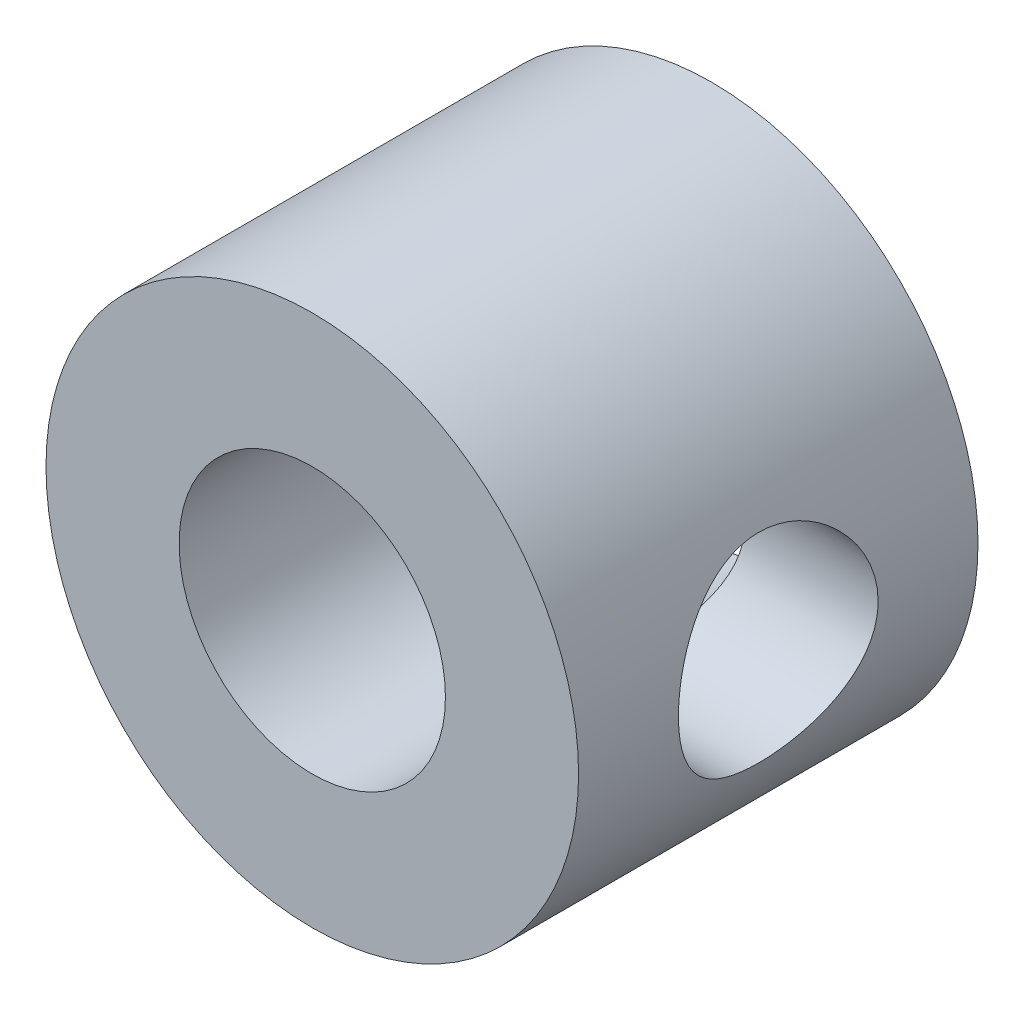
ISO-10303-21;
HEADER;
FILE_DESCRIPTION(('STEP AP214'),'2;1');
FILE_NAME('part.step','',(''),(''),'','','');
FILE_SCHEMA(('AUTOMOTIVE_DESIGN { 1 0 10303 214 1 1 1 1 }'));
ENDSEC;
DATA;
#1=APPLICATION_CONTEXT('core data for automotive mechanical design processes');
#2=APPLICATION_PROTOCOL_DEFINITION('international standard','automotive_design',2000,#1);
#3=PRODUCT_CONTEXT('',#1,'mechanical');
#4=PRODUCT('Part','Part','',(#3));
#5=PRODUCT_RELATED_PRODUCT_CATEGORY('part','',(#4));
#6=PRODUCT_DEFINITION_FORMATION('','',#4);
#7=PRODUCT_DEFINITION_CONTEXT('part definition',#1,'design');
#8=PRODUCT_DEFINITION('design','',#6,#7);
#9=PRODUCT_DEFINITION_SHAPE('','',#8);
#10=(LENGTH_UNIT() NAMED_UNIT(*) SI_UNIT(.MILLI.,.METRE.));
#11=(NAMED_UNIT(*) PLANE_ANGLE_UNIT() SI_UNIT($,.RADIAN.));
#12=(NAMED_UNIT(*) SI_UNIT($,.STERADIAN.) SOLID_ANGLE_UNIT());
#13=UNCERTAINTY_MEASURE_WITH_UNIT(LENGTH_MEASURE(1.E-05),#10,'distance_accuracy_value','');
#14=(GEOMETRIC_REPRESENTATION_CONTEXT(3) GLOBAL_UNCERTAINTY_ASSIGNED_CONTEXT((#13)) GLOBAL_UNIT_ASSIGNED_CONTEXT((#10,
#11,#12)) REPRESENTATION_CONTEXT('',''));
#15=CARTESIAN_POINT('',(0.,0.,0.));
#16=DIRECTION('',(0.,0.,1.));
#17=DIRECTION('',(1.,0.,0.));
#18=AXIS2_PLACEMENT_3D('',#15,#16,#17);
#19=CARTESIAN_POINT('',(0.,0.,6.));
#20=DIRECTION('',(0.,0.,-1.));
#21=DIRECTION('',(-1.,0.,0.));
#22=AXIS2_PLACEMENT_3D('',#19,#20,#21);
#23=CYLINDRICAL_SURFACE('',#22,4.);
#24=CARTESIAN_POINT('',(0.,0.,6.));
#25=DIRECTION('',(0.,0.,1.));
#26=DIRECTION('',(1.,0.,0.));
#27=AXIS2_PLACEMENT_3D('',#24,#25,#26);
#28=CIRCLE('',#27,4.);
#29=CARTESIAN_POINT('',(4.,0.,6.));
#30=VERTEX_POINT('',#29);
#31=EDGE_CURVE('E11',#30,#30,#28,.T.);
#32=ORIENTED_EDGE('',*,*,#31,.F.);
#33=EDGE_LOOP('',(#32));
#34=FACE_BOUND('',#33,.T.);
#35=CARTESIAN_POINT('',(0.,0.,0.));
#36=DIRECTION('',(0.,0.,1.));
#37=DIRECTION('',(1.,0.,0.));
#38=AXIS2_PLACEMENT_3D('',#35,#36,#37);
#39=CIRCLE('',#38,4.);
#40=CARTESIAN_POINT('',(4.,0.,0.));
#41=VERTEX_POINT('',#40);
#42=EDGE_CURVE('E52',#41,#41,#39,.T.);
#43=ORIENTED_EDGE('',*,*,#42,.T.);
#44=EDGE_LOOP('',(#43));
#45=FACE_BOUND('',#44,.T.);
#46=CARTESIAN_POINT('',(4.,0.,4.5));
#47=CARTESIAN_POINT('',(4.00000217456151,-0.0812350589378529,4.50000290230311));
#48=CARTESIAN_POINT('',(3.99750379283184,-0.162450241781792,4.49338023975162));
#49=CARTESIAN_POINT('',(3.98778696006928,-0.322453452352361,4.46717180473007));
#50=CARTESIAN_POINT('',(3.98056918893993,-0.401241827987616,4.44758789952943));
#51=CARTESIAN_POINT('',(3.96218832391545,-0.554060784990879,4.39624699822824));
#52=CARTESIAN_POINT('',(3.9510328434944,-0.628100224162278,4.36451348317821));
#53=CARTESIAN_POINT('',(3.92588767765353,-0.769799310160254,4.28989358698418));
#54=CARTESIAN_POINT('',(3.91189723227548,-0.837457239177879,4.24700421445584));
#55=CARTESIAN_POINT('',(3.88186246971217,-0.967346417045826,4.14938746892909));
#56=CARTESIAN_POINT('',(3.86576002583566,-1.02927073015119,4.0942697377406));
#57=CARTESIAN_POINT('',(3.83360220871327,-1.14324421474363,3.97458956534116));
#58=CARTESIAN_POINT('',(3.81754685135033,-1.19529036359203,3.91002424391213));
#59=CARTESIAN_POINT('',(3.78662470617731,-1.28998202215985,3.77028253247679));
#60=CARTESIAN_POINT('',(3.77182648820818,-1.3321939319576,3.69479563345418));
#61=CARTESIAN_POINT('',(3.74599860237433,-1.40318646334084,3.53715164583148));
#62=CARTESIAN_POINT('',(3.73496742975881,-1.43197244961239,3.4549972368449));
#63=CARTESIAN_POINT('',(3.71854412824136,-1.47408431017549,3.2898832597418));
#64=CARTESIAN_POINT('',(3.71293924350838,-1.48799593218558,3.20709496156456));
#65=CARTESIAN_POINT('',(3.70738061461215,-1.50179556531648,3.04018384200616));
#66=CARTESIAN_POINT('',(3.70742453659305,-1.5016893680263,2.95606158612553));
#67=CARTESIAN_POINT('',(3.71297511632055,-1.48790429610018,2.79423047478704));
#68=CARTESIAN_POINT('',(3.71815468871122,-1.47503808509003,2.71643909395582));
#69=CARTESIAN_POINT('',(3.73284938059529,-1.4374416786833,2.56421284959468));
#70=CARTESIAN_POINT('',(3.74236515298863,-1.41270969663258,2.48977849338612));
#71=CARTESIAN_POINT('',(3.76485702190253,-1.35163748571904,2.34472293227177));
#72=CARTESIAN_POINT('',(3.77789517988166,-1.31508648737101,2.2742005138787));
#73=CARTESIAN_POINT('',(3.80594210139319,-1.23156073762698,2.14005426240903));
#74=CARTESIAN_POINT('',(3.82095154457158,-1.18458238728897,2.0764328224803));
#75=CARTESIAN_POINT('',(3.85248038859113,-1.07781780766549,1.95339633634912));
#76=CARTESIAN_POINT('',(3.86903347455671,-1.01738298716955,1.89455135925191));
#77=CARTESIAN_POINT('',(3.90091728164085,-0.88731259081902,1.7876620337942));
#78=CARTESIAN_POINT('',(3.91624781465952,-0.817675603497364,1.73961934539433));
#79=CARTESIAN_POINT('',(3.9442639480908,-0.669723436992419,1.65506960293748));
#80=CARTESIAN_POINT('',(3.95690498259616,-0.591290713844719,1.61875241877894));
#81=CARTESIAN_POINT('',(3.97778718326962,-0.428836850524583,1.56001739572996));
#82=CARTESIAN_POINT('',(3.98603030341493,-0.344818210845767,1.53759338343888));
#83=CARTESIAN_POINT('',(3.99684443228065,-0.178375243148665,1.50837721245806));
#84=CARTESIAN_POINT('',(3.99969369025686,-0.0961036195622092,1.50081739361749));
#85=CARTESIAN_POINT('',(4.00025893700126,0.0685724752550243,1.49930893610008));
#86=CARTESIAN_POINT('',(3.99797606386863,0.150976912983373,1.50535727968322));
#87=CARTESIAN_POINT('',(3.98871709772643,0.310262048561859,1.53031004230867));
#88=CARTESIAN_POINT('',(3.98192470962305,0.387233328007336,1.54871154373709));
#89=CARTESIAN_POINT('',(3.96451477091717,0.536941754957221,1.59718607254732));
#90=CARTESIAN_POINT('',(3.9538967228203,0.609678350347535,1.62726061794804));
#91=CARTESIAN_POINT('',(3.92949624407681,0.751247765110155,1.69918641243948));
#92=CARTESIAN_POINT('',(3.91563000209348,0.819903083557795,1.74135772922339));
#93=CARTESIAN_POINT('',(3.88626671564664,0.949392711726625,1.83591810317156));
#94=CARTESIAN_POINT('',(3.87076907009516,1.01022412027045,1.88831093254515));
#95=CARTESIAN_POINT('',(3.8387332949099,1.12603079874454,2.00540412212427));
#96=CARTESIAN_POINT('',(3.82218696503729,1.18046154123569,2.0706421827727));
#97=CARTESIAN_POINT('',(3.79078815746854,1.27771050031903,2.20965138470766));
#98=CARTESIAN_POINT('',(3.77593583194399,1.32052767414518,2.2834232913885));
#99=CARTESIAN_POINT('',(3.74966829822463,1.39337773518998,2.43801598677231));
#100=CARTESIAN_POINT('',(3.73826760328493,1.42335685446918,2.51886474591044));
#101=CARTESIAN_POINT('',(3.72054032891005,1.46907883466889,2.68500976368782));
#102=CARTESIAN_POINT('',(3.71421061057491,1.48483050305535,2.77030323619812));
#103=CARTESIAN_POINT('',(3.70775894792573,1.50086347097839,2.93701615954111));
#104=CARTESIAN_POINT('',(3.70726444523341,1.50207331495837,3.01833263171689));
#105=CARTESIAN_POINT('',(3.71158412745292,1.49136715641593,3.17994531627617));
#106=CARTESIAN_POINT('',(3.71639780898899,1.47945239850124,3.26024162467158));
#107=CARTESIAN_POINT('',(3.73048141585432,1.44355815630242,3.41504722671655));
#108=CARTESIAN_POINT('',(3.73961085376663,1.41995798316524,3.48965834624534));
#109=CARTESIAN_POINT('',(3.76121548297845,1.3616969677992,3.63390550849442));
#110=CARTESIAN_POINT('',(3.77369151995215,1.32703332944945,3.70354028807014));
#111=CARTESIAN_POINT('',(3.80139723903965,1.24552075938154,3.83982678969763));
#112=CARTESIAN_POINT('',(3.81673698440964,1.1981283280301,3.90613079679991));
#113=CARTESIAN_POINT('',(3.84806246757177,1.09334485729906,4.0301415609712));
#114=CARTESIAN_POINT('',(3.86404840943145,1.03595064012808,4.08784557478675));
#115=CARTESIAN_POINT('',(3.89590424609881,0.909080396784623,4.19620195582184));
#116=CARTESIAN_POINT('',(3.91172104900645,0.839118644212992,4.24630375343467));
#117=CARTESIAN_POINT('',(3.94054514457031,0.691213223200821,4.33402265527656));
#118=CARTESIAN_POINT('',(3.95355221851559,0.613268934090622,4.37163878773637));
#119=CARTESIAN_POINT('',(3.9757429260668,0.447999082002312,4.43437682904833));
#120=CARTESIAN_POINT('',(3.98473657158356,0.360413422234209,4.4588870646019));
#121=CARTESIAN_POINT('',(3.99686242179587,0.181875733606382,4.49169295992068));
#122=CARTESIAN_POINT('',(3.99999756603967,0.090925416364859,4.49999675148732));
#123=CARTESIAN_POINT('',(4.,0.,4.5));
#124=B_SPLINE_CURVE_WITH_KNOTS('',3,(#46,#47,#48,#49,#50,#51,#52,#53,#54,#55,#56,#57,#58,#59,
#60,#61,#62,#63,#64,#65,#66,#67,#68,#69,#70,#71,#72,#73,#74,#75,#76,#77,#78,#79,#80,#81,#82,#83,
#84,#85,#86,#87,#88,#89,#90,#91,#92,#93,#94,#95,#96,#97,#98,#99,#100,#101,#102,#103,#104,#105,
#106,#107,#108,#109,#110,#111,#112,#113,#114,#115,#116,#117,#118,#119,#120,#121,#122,#123),
.UNSPECIFIED.,.T.,.F.,(4,2,2,2,2,2,2,2,2,2,2,2,2,2,2,2,2,2,2,2,2,2,2,2,2,2,2,2,2,2,2,2,2,2,2,2,
2,2,4),(0.,0.24336980156056,0.486704549530461,0.729571369213573,0.97250337960949,
1.22473618582715,1.47704604925622,1.73896674501658,2.00078269352134,2.25185874416901,
2.50283106079707,2.73878345119971,2.97477138060589,3.21522408387018,3.45575990744258,
3.71246153335813,3.96920257905066,4.22991375286075,4.49050899698846,4.73725019635925,
4.98393668390521,5.2211443792384,5.45838293254454,5.702592218596,5.94689180019868,
6.20536519455658,6.46386178920141,6.72343066727204,6.98283874956507,7.22558763480252,
7.46831350211259,7.70363142426533,7.93900886656507,8.18672471884271,8.43451941997062,
8.69572329654039,8.95694749805102,9.22948515032042,9.50188601796128),.UNSPECIFIED.);
#125=CARTESIAN_POINT('',(4.,0.,4.5));
#126=VERTEX_POINT('',#125);
#127=EDGE_CURVE('E63',#126,#126,#124,.T.);
#128=ORIENTED_EDGE('',*,*,#127,.F.);
#129=EDGE_LOOP('',(#128));
#130=FACE_BOUND('',#129,.T.);
#131=ADVANCED_FACE('F37',(#34,#45,#130),#23,.T.);
#132=CARTESIAN_POINT('',(0.,0.,6.));
#133=DIRECTION('',(0.,0.,-1.));
#134=DIRECTION('',(-1.,0.,0.));
#135=AXIS2_PLACEMENT_3D('',#132,#133,#134);
#136=CYLINDRICAL_SURFACE('',#135,2.);
#137=CARTESIAN_POINT('',(0.,0.,0.));
#138=DIRECTION('',(0.,0.,1.));
#139=DIRECTION('',(1.,0.,0.));
#140=AXIS2_PLACEMENT_3D('',#137,#138,#139);
#141=CIRCLE('',#140,2.);
#142=CARTESIAN_POINT('',(2.,0.,0.));
#143=VERTEX_POINT('',#142);
#144=EDGE_CURVE('E69',#143,#143,#141,.T.);
#145=ORIENTED_EDGE('',*,*,#144,.F.);
#146=EDGE_LOOP('',(#145));
#147=FACE_BOUND('',#146,.T.);
#148=CARTESIAN_POINT('',(0.,0.,6.));
#149=DIRECTION('',(0.,0.,1.));
#150=DIRECTION('',(1.,0.,0.));
#151=AXIS2_PLACEMENT_3D('',#148,#149,#150);
#152=CIRCLE('',#151,2.);
#153=CARTESIAN_POINT('',(2.,0.,6.));
#154=VERTEX_POINT('',#153);
#155=EDGE_CURVE('E59',#154,#154,#152,.T.);
#156=ORIENTED_EDGE('',*,*,#155,.T.);
#157=EDGE_LOOP('',(#156));
#158=FACE_BOUND('',#157,.T.);
#159=CARTESIAN_POINT('',(2.,0.,4.5));
#160=CARTESIAN_POINT('',(1.99999540196395,-0.0732207358411543,4.49999520798798));
#161=CARTESIAN_POINT('',(1.99593645526274,-0.146561062021485,4.4945949756255));
#162=CARTESIAN_POINT('',(1.98006607281083,-0.290936396286467,4.47333293658984));
#163=CARTESIAN_POINT('',(1.96823514679854,-0.361965136229004,4.45744482834995));
#164=CARTESIAN_POINT('',(1.9379567495606,-0.499234626631249,4.41628709071623));
#165=CARTESIAN_POINT('',(1.91954951932009,-0.565501615403737,4.39107448643083));
#166=CARTESIAN_POINT('',(1.87750556721694,-0.692422335520753,4.33245765581277));
#167=CARTESIAN_POINT('',(1.85387037535483,-0.753077701796333,4.29905582580648));
#168=CARTESIAN_POINT('',(1.80049544543983,-0.873465937590145,4.22173698840918));
#169=CARTESIAN_POINT('',(1.7703930854844,-0.932593229272032,4.17713267066593));
#170=CARTESIAN_POINT('',(1.70767017883378,-1.04302716767671,4.08050416263883));
#171=CARTESIAN_POINT('',(1.67504578078609,-1.09432148272226,4.02846851720017));
#172=CARTESIAN_POINT('',(1.6027112365199,-1.19837161436623,3.90641704672163));
#173=CARTESIAN_POINT('',(1.56290854864639,-1.24930578421204,3.8348963228783));
#174=CARTESIAN_POINT('',(1.48711444664135,-1.33861998176348,3.68254898763345));
#175=CARTESIAN_POINT('',(1.45111786883675,-1.37701716983077,3.60173530299969));
#176=CARTESIAN_POINT('',(1.39977155180179,-1.42880627811788,3.46049716132377));
#177=CARTESIAN_POINT('',(1.38157751186733,-1.44625674456539,3.40260930287162));
#178=CARTESIAN_POINT('',(1.35171594150685,-1.47420672564844,3.28360726521508));
#179=CARTESIAN_POINT('',(1.34003347910832,-1.48472215355267,3.22250082212521));
#180=CARTESIAN_POINT('',(1.32503759684553,-1.49812822141445,3.09781741446923));
#181=CARTESIAN_POINT('',(1.32180026676597,-1.50094954854207,3.03422319327594));
#182=CARTESIAN_POINT('',(1.32459531776068,-1.49848213241869,2.90738508911843));
#183=CARTESIAN_POINT('',(1.33063102218113,-1.49319048157349,2.84414133991256));
#184=CARTESIAN_POINT('',(1.34967623262519,-1.47597739291882,2.72680865257421));
#185=CARTESIAN_POINT('',(1.36187157059871,-1.46482486380817,2.67246362895382));
#186=CARTESIAN_POINT('',(1.39114192844939,-1.43705671120732,2.56656112127912));
#187=CARTESIAN_POINT('',(1.40822163640769,-1.42043583681172,2.5150063721764));
#188=CARTESIAN_POINT('',(1.45741769294306,-1.37033064172535,2.38374361336585));
#189=CARTESIAN_POINT('',(1.49225649139233,-1.3328014849398,2.30659958335649));
#190=CARTESIAN_POINT('',(1.56533298145196,-1.24618023314519,2.16080347613092));
#191=CARTESIAN_POINT('',(1.60357878886109,-1.19706004255878,2.09217266074534));
#192=CARTESIAN_POINT('',(1.68051672313145,-1.08651604102135,1.96224660959635));
#193=CARTESIAN_POINT('',(1.71919586730239,-1.02481375526036,1.90117939311852));
#194=CARTESIAN_POINT('',(1.79248037980972,-0.890422521709589,1.78973635321884));
#195=CARTESIAN_POINT('',(1.8270934826376,-0.817755054293756,1.73934007976962));
#196=CARTESIAN_POINT('',(1.88279726073643,-0.677902080454142,1.66001920075967));
#197=CARTESIAN_POINT('',(1.90520770945008,-0.612539870185619,1.62881540578422));
#198=CARTESIAN_POINT('',(1.94372904416948,-0.476352173202085,1.57577511953614));
#199=CARTESIAN_POINT('',(1.95984387504352,-0.405530141063765,1.55393276150072));
#200=CARTESIAN_POINT('',(1.98445588635989,-0.259676232483517,1.52074663711356));
#201=CARTESIAN_POINT('',(1.99290592971749,-0.184621281405942,1.50946782106137));
#202=CARTESIAN_POINT('',(2.00115883659445,-0.0332012397969165,1.49845040262829));
#203=CARTESIAN_POINT('',(2.00096534845408,0.0431632843727243,1.49870693130463));
#204=CARTESIAN_POINT('',(1.99242547175873,0.186804217329626,1.51011086927319));
#205=CARTESIAN_POINT('',(1.98490086600401,0.254222327546134,1.52016053688867));
#206=CARTESIAN_POINT('',(1.96351320201588,0.386110670609119,1.54897378000787));
#207=CARTESIAN_POINT('',(1.94964879507262,0.450580272987262,1.56773920968941));
#208=CARTESIAN_POINT('',(1.91599830683313,0.57741677968977,1.6138875305931));
#209=CARTESIAN_POINT('',(1.89602050290193,0.63962917253614,1.6415511814274));
#210=CARTESIAN_POINT('',(1.85166985411963,0.758518527043074,1.70417245542559));
#211=CARTESIAN_POINT('',(1.82729640132068,0.815194721336404,1.73913108763974));
#212=CARTESIAN_POINT('',(1.77119146886499,0.931511626319037,1.82178324641056));
#213=CARTESIAN_POINT('',(1.73891095025037,0.990066762698702,1.87062853943746));
#214=CARTESIAN_POINT('',(1.67238952874785,1.09871974855854,1.97600875258839));
#215=CARTESIAN_POINT('',(1.63814438507395,1.14879830469577,2.03256069969336));
#216=CARTESIAN_POINT('',(1.56369128291497,1.24877541075626,2.16414988096118));
#217=CARTESIAN_POINT('',(1.523587185201,1.29683043648705,2.2406575614923));
#218=CARTESIAN_POINT('',(1.4494059134845,1.37923235998283,2.40336007797245));
#219=CARTESIAN_POINT('',(1.41531099570969,1.41362000515519,2.48952512190858));
#220=CARTESIAN_POINT('',(1.37118877808583,1.45615734256767,2.63541444887448));
#221=CARTESIAN_POINT('',(1.35695811824565,1.46931009512996,2.69239112640238));
#222=CARTESIAN_POINT('',(1.33542056103011,1.48891522181906,2.80870704698318));
#223=CARTESIAN_POINT('',(1.32809821220233,1.4953825519924,2.86804070680225));
#224=CARTESIAN_POINT('',(1.32157601792209,1.50115320209064,2.98782907981133));
#225=CARTESIAN_POINT('',(1.32241740684975,1.50042015325262,3.04828794300957));
#226=CARTESIAN_POINT('',(1.33216448543666,1.49176883838219,3.16805683875216));
#227=CARTESIAN_POINT('',(1.34108058157484,1.48384130024584,3.22736528789726));
#228=CARTESIAN_POINT('',(1.36817348797773,1.45893841819723,3.3559145714108));
#229=CARTESIAN_POINT('',(1.38794705950643,1.44036567954111,3.42449718013278));
#230=CARTESIAN_POINT('',(1.4338296338541,1.39469627266119,3.55653484883049));
#231=CARTESIAN_POINT('',(1.4599546014693,1.3675780729773,3.61997644203819));
#232=CARTESIAN_POINT('',(1.52516477328824,1.29498918933642,3.76252063048634));
#233=CARTESIAN_POINT('',(1.56560203191105,1.2464154206597,3.83942158275575));
#234=CARTESIAN_POINT('',(1.64713510181273,1.13650718465936,3.98312604497757));
#235=CARTESIAN_POINT('',(1.68823146954223,1.07516134758577,4.04992046594485));
#236=CARTESIAN_POINT('',(1.76728988939793,0.93962714493789,4.17283184228333));
#237=CARTESIAN_POINT('',(1.80522333711072,0.865337161562858,4.2288563193772));
#238=CARTESIAN_POINT('',(1.87357289668097,0.705159098936201,4.32722305114535));
#239=CARTESIAN_POINT('',(1.90400691592959,0.619299420401792,4.36959797457251));
#240=CARTESIAN_POINT('',(1.94636704624048,0.464840290356452,4.42779942098571));
#241=CARTESIAN_POINT('',(1.96110322499718,0.39855361477473,4.44776673137618));
#242=CARTESIAN_POINT('',(1.98383739970238,0.262841610392758,4.47841790261149));
#243=CARTESIAN_POINT('',(1.99185421210894,0.193425623834904,4.48912769024996));
#244=CARTESIAN_POINT('',(1.99745471706309,0.102963309861887,4.49660469421435));
#245=CARTESIAN_POINT('',(1.9984076143208,0.0824069459941224,4.49787627748942));
#246=CARTESIAN_POINT('',(1.99968095423138,0.0412368896243776,4.49957467323097));
#247=CARTESIAN_POINT('',(2.00000129507253,0.0206231884283878,4.50000134970737));
#248=CARTESIAN_POINT('',(2.,0.,4.5));
#249=B_SPLINE_CURVE_WITH_KNOTS('',3,(#159,#160,#161,#162,#163,#164,#165,#166,#167,#168,#169,
#170,#171,#172,#173,#174,#175,#176,#177,#178,#179,#180,#181,#182,#183,#184,#185,#186,#187,#188,
#189,#190,#191,#192,#193,#194,#195,#196,#197,#198,#199,#200,#201,#202,#203,#204,#205,#206,#207,
#208,#209,#210,#211,#212,#213,#214,#215,#216,#217,#218,#219,#220,#221,#222,#223,#224,#225,#226,
#227,#228,#229,#230,#231,#232,#233,#234,#235,#236,#237,#238,#239,#240,#241,#242,#243,#244,#245,
#246,#247,#248),.UNSPECIFIED.,.T.,.F.,(4,2,2,2,2,2,2,2,2,2,2,2,2,2,2,2,2,2,2,2,2,2,2,2,2,2,2,2,
2,2,2,2,2,2,2,2,2,2,2,2,2,2,2,2,4),(0.,0.219571786572042,0.439696319423244,0.658496333573381,
0.877232398849293,1.1162243131743,1.35558868405162,1.64360015887451,1.93121574056507,
2.11999518529902,2.3083399319529,2.49837587621257,2.6884799430021,2.85826890162709,
3.0282213760064,3.3044933180591,3.58144192357889,3.86535883938091,4.14872662493691,
4.37526505006389,4.60166129643117,4.82944058166899,5.05712372466614,5.26191187011994,
5.46674360185812,5.6788043948368,5.89089453977541,6.13840382081868,6.38646908985452,
6.68168596015947,6.97601595850113,7.15589161422933,7.33536399114209,7.51574333854741,
7.69635548563854,7.91639670960135,8.13699685139922,8.43412246655768,8.73151372390893,
9.0313544949265,9.33047220273165,9.5419569754163,9.75284752283257,9.81468166878711,
9.87652576630966),.UNSPECIFIED.);
#250=CARTESIAN_POINT('',(2.,0.,4.5));
#251=VERTEX_POINT('',#250);
#252=EDGE_CURVE('E44',#251,#251,#249,.T.);
#253=ORIENTED_EDGE('',*,*,#252,.T.);
#254=EDGE_LOOP('',(#253));
#255=FACE_BOUND('',#254,.T.);
#256=ADVANCED_FACE('F45',(#147,#158,#255),#136,.F.);
#257=CARTESIAN_POINT('',(0.,0.,6.));
#258=DIRECTION('',(0.,0.,1.));
#259=DIRECTION('',(1.,0.,0.));
#260=AXIS2_PLACEMENT_3D('',#257,#258,#259);
#261=PLANE('',#260);
#262=ORIENTED_EDGE('',*,*,#31,.T.);
#263=EDGE_LOOP('',(#262));
#264=FACE_BOUND('',#263,.T.);
#265=ORIENTED_EDGE('',*,*,#155,.F.);
#266=EDGE_LOOP('',(#265));
#267=FACE_BOUND('',#266,.T.);
#268=ADVANCED_FACE('F83',(#264,#267),#261,.T.);
#269=CARTESIAN_POINT('',(0.,0.,0.));
#270=DIRECTION('',(0.,0.,1.));
#271=DIRECTION('',(1.,0.,0.));
#272=AXIS2_PLACEMENT_3D('',#269,#270,#271);
#273=PLANE('',#272);
#274=ORIENTED_EDGE('',*,*,#42,.F.);
#275=EDGE_LOOP('',(#274));
#276=FACE_BOUND('',#275,.T.);
#277=ORIENTED_EDGE('',*,*,#144,.T.);
#278=EDGE_LOOP('',(#277));
#279=FACE_BOUND('',#278,.T.);
#280=ADVANCED_FACE('F79',(#276,#279),#273,.F.);
#281=CARTESIAN_POINT('',(4.,0.,3.));
#282=DIRECTION('',(-1.,0.,0.));
#283=DIRECTION('',(0.,0.,1.));
#284=AXIS2_PLACEMENT_3D('',#281,#282,#283);
#285=CYLINDRICAL_SURFACE('',#284,1.5);
#286=ORIENTED_EDGE('',*,*,#252,.F.);
#287=EDGE_LOOP('',(#286));
#288=FACE_BOUND('',#287,.T.);
#289=ORIENTED_EDGE('',*,*,#127,.T.);
#290=EDGE_LOOP('',(#289));
#291=FACE_BOUND('',#290,.T.);
#292=ADVANCED_FACE('F76',(#288,#291),#285,.F.);
#293=CLOSED_SHELL('',(#131,#256,#268,#280,#292));
#294=MANIFOLD_SOLID_BREP('B2',#293);
#295=ADVANCED_BREP_SHAPE_REPRESENTATION('',(#18,#294),#14);
#296=SHAPE_DEFINITION_REPRESENTATION(#9,#295);
ENDSEC;
END-ISO-10303-21;
